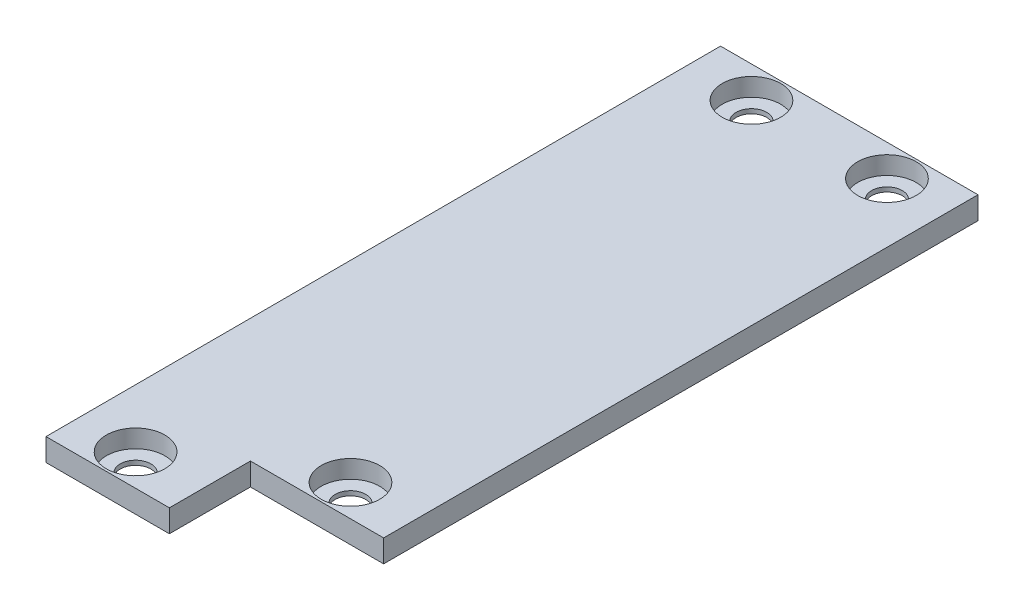
ISO-10303-21;
HEADER;
FILE_DESCRIPTION(('STEP AP214'),'2;1');
FILE_NAME('part.step','',(''),(''),'','','');
FILE_SCHEMA(('AUTOMOTIVE_DESIGN { 1 0 10303 214 1 1 1 1 }'));
ENDSEC;
DATA;
#1=APPLICATION_CONTEXT('core data for automotive mechanical design processes');
#2=APPLICATION_PROTOCOL_DEFINITION('international standard','automotive_design',2000,#1);
#3=PRODUCT_CONTEXT('',#1,'mechanical');
#4=PRODUCT('Part','Part','',(#3));
#5=PRODUCT_RELATED_PRODUCT_CATEGORY('part','',(#4));
#6=PRODUCT_DEFINITION_FORMATION('','',#4);
#7=PRODUCT_DEFINITION_CONTEXT('part definition',#1,'design');
#8=PRODUCT_DEFINITION('design','',#6,#7);
#9=PRODUCT_DEFINITION_SHAPE('','',#8);
#10=(LENGTH_UNIT() NAMED_UNIT(*) SI_UNIT(.MILLI.,.METRE.));
#11=(NAMED_UNIT(*) PLANE_ANGLE_UNIT() SI_UNIT($,.RADIAN.));
#12=(NAMED_UNIT(*) SI_UNIT($,.STERADIAN.) SOLID_ANGLE_UNIT());
#13=UNCERTAINTY_MEASURE_WITH_UNIT(LENGTH_MEASURE(1.E-05),#10,'distance_accuracy_value','');
#14=(GEOMETRIC_REPRESENTATION_CONTEXT(3) GLOBAL_UNCERTAINTY_ASSIGNED_CONTEXT((#13)) GLOBAL_UNIT_ASSIGNED_CONTEXT((#10,
#11,#12)) REPRESENTATION_CONTEXT('',''));
#15=CARTESIAN_POINT('',(0.,0.,0.));
#16=DIRECTION('',(0.,0.,1.));
#17=DIRECTION('',(1.,0.,0.));
#18=AXIS2_PLACEMENT_3D('',#15,#16,#17);
#19=CARTESIAN_POINT('',(0.,2.5,0.));
#20=DIRECTION('',(0.,-1.,0.));
#21=DIRECTION('',(0.,0.,-1.));
#22=AXIS2_PLACEMENT_3D('',#19,#20,#21);
#23=PLANE('',#22);
#24=CARTESIAN_POINT('',(21.88,2.5,-72.0000034625994));
#25=DIRECTION('',(0.,1.,0.));
#26=DIRECTION('',(0.,0.,1.));
#27=AXIS2_PLACEMENT_3D('',#24,#25,#26);
#28=CIRCLE('',#27,3.25);
#29=CARTESIAN_POINT('',(21.88,2.5,-68.7500034625994));
#30=VERTEX_POINT('',#29);
#31=EDGE_CURVE('E150',#30,#30,#28,.T.);
#32=ORIENTED_EDGE('',*,*,#31,.F.);
#33=EDGE_LOOP('',(#32));
#34=FACE_BOUND('',#33,.T.);
#35=CARTESIAN_POINT('',(21.31,2.5,-13.));
#36=DIRECTION('',(0.,1.,0.));
#37=DIRECTION('',(0.,0.,1.));
#38=AXIS2_PLACEMENT_3D('',#35,#36,#37);
#39=CIRCLE('',#38,3.25);
#40=CARTESIAN_POINT('',(21.31,2.5,-9.75));
#41=VERTEX_POINT('',#40);
#42=EDGE_CURVE('E166',#41,#41,#39,.T.);
#43=ORIENTED_EDGE('',*,*,#42,.F.);
#44=EDGE_LOOP('',(#43));
#45=FACE_BOUND('',#44,.T.);
#46=CARTESIAN_POINT('',(6.44473684666131,2.5,-3.99999653740062));
#47=DIRECTION('',(0.,1.,0.));
#48=DIRECTION('',(0.,0.,1.));
#49=AXIS2_PLACEMENT_3D('',#46,#47,#48);
#50=CIRCLE('',#49,3.25);
#51=CARTESIAN_POINT('',(6.44473684666131,2.5,-0.749996537400622));
#52=VERTEX_POINT('',#51);
#53=EDGE_CURVE('E182',#52,#52,#50,.T.);
#54=ORIENTED_EDGE('',*,*,#53,.F.);
#55=EDGE_LOOP('',(#54));
#56=FACE_BOUND('',#55,.T.);
#57=DIRECTION('',(-1.,0.,0.));
#58=VECTOR('',#57,1.);
#59=CARTESIAN_POINT('',(-0.000657894167335672,2.5,-0.499999567175077));
#60=LINE('',#59,#58);
#61=CARTESIAN_POINT('',(13.7,2.5,-0.499999567175077));
#62=VERTEX_POINT('',#61);
#63=CARTESIAN_POINT('',(-0.000657894167335672,2.5,-0.499999567175077));
#64=VERTEX_POINT('',#63);
#65=EDGE_CURVE('E111',#62,#64,#60,.T.);
#66=ORIENTED_EDGE('',*,*,#65,.F.);
#67=DIRECTION('',(0.,0.,1.));
#68=VECTOR('',#67,1.);
#69=CARTESIAN_POINT('',(13.7,2.5,-0.499999567175077));
#70=LINE('',#69,#68);
#71=CARTESIAN_POINT('',(13.7,2.5,-9.5));
#72=VERTEX_POINT('',#71);
#73=EDGE_CURVE('E54',#72,#62,#70,.T.);
#74=ORIENTED_EDGE('',*,*,#73,.F.);
#75=DIRECTION('',(-1.,0.,0.));
#76=VECTOR('',#75,1.);
#77=CARTESIAN_POINT('',(13.9,2.5,-9.5));
#78=LINE('',#77,#76);
#79=CARTESIAN_POINT('',(28.49,2.5,-9.5));
#80=VERTEX_POINT('',#79);
#81=EDGE_CURVE('E93',#80,#72,#78,.T.);
#82=ORIENTED_EDGE('',*,*,#81,.F.);
#83=DIRECTION('',(0.,0.,-1.));
#84=VECTOR('',#83,1.);
#85=CARTESIAN_POINT('',(28.49,2.5,-9.));
#86=LINE('',#85,#84);
#87=CARTESIAN_POINT('',(28.49,2.5,-75.5000004328249));
#88=VERTEX_POINT('',#87);
#89=EDGE_CURVE('E202',#80,#88,#86,.T.);
#90=ORIENTED_EDGE('',*,*,#89,.T.);
#91=DIRECTION('',(1.,0.,0.));
#92=VECTOR('',#91,1.);
#93=CARTESIAN_POINT('',(-0.0993421058326638,2.5,-75.5000004328249));
#94=LINE('',#93,#92);
#95=CARTESIAN_POINT('',(-0.0993421058326638,2.5,-75.5000004328249));
#96=VERTEX_POINT('',#95);
#97=EDGE_CURVE('E123',#96,#88,#94,.T.);
#98=ORIENTED_EDGE('',*,*,#97,.F.);
#99=DIRECTION('',(0.00131578833467125,0.,0.999999134350154));
#100=VECTOR('',#99,1.);
#101=CARTESIAN_POINT('',(-0.0999999999999994,2.5,-76.));
#102=LINE('',#101,#100);
#103=EDGE_CURVE('E199',#96,#64,#102,.T.);
#104=ORIENTED_EDGE('',*,*,#103,.T.);
#105=EDGE_LOOP('',(#66,#74,#82,#90,#98,#104));
#106=FACE_BOUND('',#105,.T.);
#107=CARTESIAN_POINT('',(6.83526315333869,2.5,-72.0000034625994));
#108=DIRECTION('',(0.,1.,0.));
#109=DIRECTION('',(0.,0.,1.));
#110=AXIS2_PLACEMENT_3D('',#107,#108,#109);
#111=CIRCLE('',#110,3.25);
#112=CARTESIAN_POINT('',(6.83526315333869,2.5,-68.7500034625994));
#113=VERTEX_POINT('',#112);
#114=EDGE_CURVE('E132',#113,#113,#111,.T.);
#115=ORIENTED_EDGE('',*,*,#114,.F.);
#116=EDGE_LOOP('',(#115));
#117=FACE_BOUND('',#116,.T.);
#118=ADVANCED_FACE('F38',(#34,#45,#56,#106,#117),#23,.F.);
#119=CARTESIAN_POINT('',(-0.0999999999999994,2.5,-76.));
#120=DIRECTION('',(0.999999134350154,0.,-0.00131578833467125));
#121=DIRECTION('',(-0.00131578833467125,0.,-0.999999134350155));
#122=AXIS2_PLACEMENT_3D('',#119,#120,#121);
#123=PLANE('',#122);
#124=DIRECTION('',(0.00131578833467125,0.,0.999999134350154));
#125=VECTOR('',#124,1.);
#126=CARTESIAN_POINT('',(-0.0999999999999994,0.,-76.));
#127=LINE('',#126,#125);
#128=CARTESIAN_POINT('',(-0.0993421058326638,0.,-75.5000004328249));
#129=VERTEX_POINT('',#128);
#130=CARTESIAN_POINT('',(-0.000657894167335624,0.,-0.499999567175081));
#131=VERTEX_POINT('',#130);
#132=EDGE_CURVE('E198',#129,#131,#127,.T.);
#133=ORIENTED_EDGE('',*,*,#132,.T.);
#134=DIRECTION('',(0.,1.,0.));
#135=VECTOR('',#134,1.);
#136=CARTESIAN_POINT('',(-0.000657894167335672,-7.5,-0.499999567175077));
#137=LINE('',#136,#135);
#138=EDGE_CURVE('E61',#131,#64,#137,.T.);
#139=ORIENTED_EDGE('',*,*,#138,.T.);
#140=ORIENTED_EDGE('',*,*,#103,.F.);
#141=DIRECTION('',(0.,1.,0.));
#142=VECTOR('',#141,1.);
#143=CARTESIAN_POINT('',(-0.0993421058326638,-7.5,-75.5000004328249));
#144=LINE('',#143,#142);
#145=EDGE_CURVE('E127',#129,#96,#144,.T.);
#146=ORIENTED_EDGE('',*,*,#145,.F.);
#147=EDGE_LOOP('',(#133,#139,#140,#146));
#148=FACE_BOUND('',#147,.T.);
#149=ADVANCED_FACE('F40',(#148),#123,.F.);
#150=CARTESIAN_POINT('',(28.49,2.5,-9.));
#151=DIRECTION('',(-1.,0.,0.));
#152=DIRECTION('',(0.,0.,1.));
#153=AXIS2_PLACEMENT_3D('',#150,#151,#152);
#154=PLANE('',#153);
#155=ORIENTED_EDGE('',*,*,#89,.F.);
#156=DIRECTION('',(0.,1.,0.));
#157=VECTOR('',#156,1.);
#158=CARTESIAN_POINT('',(28.49,-7.5,-9.5));
#159=LINE('',#158,#157);
#160=CARTESIAN_POINT('',(28.49,0.,-9.5));
#161=VERTEX_POINT('',#160);
#162=EDGE_CURVE('E97',#161,#80,#159,.T.);
#163=ORIENTED_EDGE('',*,*,#162,.F.);
#164=DIRECTION('',(0.,0.,-1.));
#165=VECTOR('',#164,1.);
#166=CARTESIAN_POINT('',(28.49,0.,-9.));
#167=LINE('',#166,#165);
#168=CARTESIAN_POINT('',(28.49,0.,-75.5000004328249));
#169=VERTEX_POINT('',#168);
#170=EDGE_CURVE('E203',#161,#169,#167,.T.);
#171=ORIENTED_EDGE('',*,*,#170,.T.);
#172=DIRECTION('',(0.,1.,0.));
#173=VECTOR('',#172,1.);
#174=CARTESIAN_POINT('',(28.49,-7.5,-75.5000004328249));
#175=LINE('',#174,#173);
#176=EDGE_CURVE('E128',#169,#88,#175,.T.);
#177=ORIENTED_EDGE('',*,*,#176,.T.);
#178=EDGE_LOOP('',(#155,#163,#171,#177));
#179=FACE_BOUND('',#178,.T.);
#180=ADVANCED_FACE('F231',(#179),#154,.F.);
#181=CARTESIAN_POINT('',(0.,0.,0.));
#182=DIRECTION('',(0.,-1.,0.));
#183=DIRECTION('',(0.,0.,-1.));
#184=AXIS2_PLACEMENT_3D('',#181,#182,#183);
#185=PLANE('',#184);
#186=DIRECTION('',(0.,0.,-1.));
#187=VECTOR('',#186,1.);
#188=CARTESIAN_POINT('',(13.7,0.,0.));
#189=LINE('',#188,#187);
#190=CARTESIAN_POINT('',(13.7,0.,-0.499999567175077));
#191=VERTEX_POINT('',#190);
#192=CARTESIAN_POINT('',(13.7,0.,-9.5));
#193=VERTEX_POINT('',#192);
#194=EDGE_CURVE('E105',#191,#193,#189,.T.);
#195=ORIENTED_EDGE('',*,*,#194,.F.);
#196=DIRECTION('',(1.,0.,0.));
#197=VECTOR('',#196,1.);
#198=CARTESIAN_POINT('',(0.,0.,-0.499999567175077));
#199=LINE('',#198,#197);
#200=EDGE_CURVE('E47',#131,#191,#199,.T.);
#201=ORIENTED_EDGE('',*,*,#200,.F.);
#202=ORIENTED_EDGE('',*,*,#132,.F.);
#203=DIRECTION('',(-1.,0.,0.));
#204=VECTOR('',#203,1.);
#205=CARTESIAN_POINT('',(0.,0.,-75.5000004328249));
#206=LINE('',#205,#204);
#207=EDGE_CURVE('E206',#169,#129,#206,.T.);
#208=ORIENTED_EDGE('',*,*,#207,.F.);
#209=ORIENTED_EDGE('',*,*,#170,.F.);
#210=DIRECTION('',(1.,0.,0.));
#211=VECTOR('',#210,1.);
#212=CARTESIAN_POINT('',(0.,0.,-9.5));
#213=LINE('',#212,#211);
#214=EDGE_CURVE('E214',#193,#161,#213,.T.);
#215=ORIENTED_EDGE('',*,*,#214,.F.);
#216=EDGE_LOOP('',(#195,#201,#202,#208,#209,#215));
#217=FACE_BOUND('',#216,.T.);
#218=CARTESIAN_POINT('',(6.83526315333869,0.,-72.0000034625994));
#219=DIRECTION('',(0.,-1.,0.));
#220=DIRECTION('',(0.,0.,-1.));
#221=AXIS2_PLACEMENT_3D('',#218,#219,#220);
#222=CIRCLE('',#221,1.7);
#223=CARTESIAN_POINT('',(6.83526315333869,0.,-73.7000034625994));
#224=VERTEX_POINT('',#223);
#225=EDGE_CURVE('E146',#224,#224,#222,.T.);
#226=ORIENTED_EDGE('',*,*,#225,.F.);
#227=EDGE_LOOP('',(#226));
#228=FACE_BOUND('',#227,.T.);
#229=CARTESIAN_POINT('',(21.88,0.,-72.0000034625994));
#230=DIRECTION('',(0.,-1.,0.));
#231=DIRECTION('',(0.,0.,-1.));
#232=AXIS2_PLACEMENT_3D('',#229,#230,#231);
#233=CIRCLE('',#232,1.7);
#234=CARTESIAN_POINT('',(21.88,0.,-73.7000034625994));
#235=VERTEX_POINT('',#234);
#236=EDGE_CURVE('E162',#235,#235,#233,.T.);
#237=ORIENTED_EDGE('',*,*,#236,.F.);
#238=EDGE_LOOP('',(#237));
#239=FACE_BOUND('',#238,.T.);
#240=CARTESIAN_POINT('',(21.31,0.,-13.));
#241=DIRECTION('',(0.,-1.,0.));
#242=DIRECTION('',(0.,0.,-1.));
#243=AXIS2_PLACEMENT_3D('',#240,#241,#242);
#244=CIRCLE('',#243,1.7);
#245=CARTESIAN_POINT('',(21.31,0.,-14.7));
#246=VERTEX_POINT('',#245);
#247=EDGE_CURVE('E178',#246,#246,#244,.T.);
#248=ORIENTED_EDGE('',*,*,#247,.F.);
#249=EDGE_LOOP('',(#248));
#250=FACE_BOUND('',#249,.T.);
#251=CARTESIAN_POINT('',(6.44473684666131,0.,-3.99999653740062));
#252=DIRECTION('',(0.,-1.,0.));
#253=DIRECTION('',(0.,0.,-1.));
#254=AXIS2_PLACEMENT_3D('',#251,#252,#253);
#255=CIRCLE('',#254,1.7);
#256=CARTESIAN_POINT('',(6.44473684666131,0.,-5.69999653740062));
#257=VERTEX_POINT('',#256);
#258=EDGE_CURVE('E194',#257,#257,#255,.T.);
#259=ORIENTED_EDGE('',*,*,#258,.F.);
#260=EDGE_LOOP('',(#259));
#261=FACE_BOUND('',#260,.T.);
#262=ADVANCED_FACE('F220',(#217,#228,#239,#250,#261),#185,.T.);
#263=CARTESIAN_POINT('',(6.44473684666131,2.5,-3.99999653740062));
#264=DIRECTION('',(0.,1.,0.));
#265=DIRECTION('',(0.,0.,1.));
#266=AXIS2_PLACEMENT_3D('',#263,#264,#265);
#267=CYLINDRICAL_SURFACE('',#266,1.7);
#268=CARTESIAN_POINT('',(6.44473684666131,0.499999999999998,-3.99999653740062));
#269=DIRECTION('',(0.,1.,0.));
#270=DIRECTION('',(0.,0.,1.));
#271=AXIS2_PLACEMENT_3D('',#268,#269,#270);
#272=CIRCLE('',#271,1.7);
#273=CARTESIAN_POINT('',(6.44473684666131,0.499999999999998,-2.29999653740062));
#274=VERTEX_POINT('',#273);
#275=EDGE_CURVE('E190',#274,#274,#272,.T.);
#276=ORIENTED_EDGE('',*,*,#275,.T.);
#277=EDGE_LOOP('',(#276));
#278=FACE_BOUND('',#277,.T.);
#279=ORIENTED_EDGE('',*,*,#258,.T.);
#280=EDGE_LOOP('',(#279));
#281=FACE_BOUND('',#280,.T.);
#282=ADVANCED_FACE('F239',(#278,#281),#267,.F.);
#283=CARTESIAN_POINT('',(8.14473684666131,0.499999999999998,-3.99999653740062));
#284=DIRECTION('',(0.,-1.,0.));
#285=DIRECTION('',(0.,0.,-1.));
#286=AXIS2_PLACEMENT_3D('',#283,#284,#285);
#287=PLANE('',#286);
#288=ORIENTED_EDGE('',*,*,#275,.F.);
#289=EDGE_LOOP('',(#288));
#290=FACE_BOUND('',#289,.T.);
#291=CARTESIAN_POINT('',(6.44473684666131,0.499999999999998,-3.99999653740062));
#292=DIRECTION('',(0.,1.,0.));
#293=DIRECTION('',(0.,0.,1.));
#294=AXIS2_PLACEMENT_3D('',#291,#292,#293);
#295=CIRCLE('',#294,3.25);
#296=CARTESIAN_POINT('',(6.44473684666131,0.499999999999998,-0.749996537400622));
#297=VERTEX_POINT('',#296);
#298=EDGE_CURVE('E186',#297,#297,#295,.T.);
#299=ORIENTED_EDGE('',*,*,#298,.T.);
#300=EDGE_LOOP('',(#299));
#301=FACE_BOUND('',#300,.T.);
#302=ADVANCED_FACE('F251',(#290,#301),#287,.F.);
#303=CARTESIAN_POINT('',(6.44473684666131,2.5,-3.99999653740062));
#304=DIRECTION('',(0.,1.,0.));
#305=DIRECTION('',(0.,0.,1.));
#306=AXIS2_PLACEMENT_3D('',#303,#304,#305);
#307=CYLINDRICAL_SURFACE('',#306,3.25);
#308=ORIENTED_EDGE('',*,*,#298,.F.);
#309=EDGE_LOOP('',(#308));
#310=FACE_BOUND('',#309,.T.);
#311=ORIENTED_EDGE('',*,*,#53,.T.);
#312=EDGE_LOOP('',(#311));
#313=FACE_BOUND('',#312,.T.);
#314=ADVANCED_FACE('F255',(#310,#313),#307,.F.);
#315=CARTESIAN_POINT('',(21.31,2.5,-13.));
#316=DIRECTION('',(0.,1.,0.));
#317=DIRECTION('',(0.,0.,1.));
#318=AXIS2_PLACEMENT_3D('',#315,#316,#317);
#319=CYLINDRICAL_SURFACE('',#318,1.7);
#320=CARTESIAN_POINT('',(21.31,0.499999999999998,-13.));
#321=DIRECTION('',(0.,1.,0.));
#322=DIRECTION('',(0.,0.,1.));
#323=AXIS2_PLACEMENT_3D('',#320,#321,#322);
#324=CIRCLE('',#323,1.7);
#325=CARTESIAN_POINT('',(21.31,0.499999999999998,-11.3));
#326=VERTEX_POINT('',#325);
#327=EDGE_CURVE('E174',#326,#326,#324,.T.);
#328=ORIENTED_EDGE('',*,*,#327,.T.);
#329=EDGE_LOOP('',(#328));
#330=FACE_BOUND('',#329,.T.);
#331=ORIENTED_EDGE('',*,*,#247,.T.);
#332=EDGE_LOOP('',(#331));
#333=FACE_BOUND('',#332,.T.);
#334=ADVANCED_FACE('F259',(#330,#333),#319,.F.);
#335=CARTESIAN_POINT('',(23.01,0.499999999999998,-13.));
#336=DIRECTION('',(0.,-1.,0.));
#337=DIRECTION('',(0.,0.,-1.));
#338=AXIS2_PLACEMENT_3D('',#335,#336,#337);
#339=PLANE('',#338);
#340=ORIENTED_EDGE('',*,*,#327,.F.);
#341=EDGE_LOOP('',(#340));
#342=FACE_BOUND('',#341,.T.);
#343=CARTESIAN_POINT('',(21.31,0.499999999999998,-13.));
#344=DIRECTION('',(0.,1.,0.));
#345=DIRECTION('',(0.,0.,1.));
#346=AXIS2_PLACEMENT_3D('',#343,#344,#345);
#347=CIRCLE('',#346,3.25);
#348=CARTESIAN_POINT('',(21.31,0.499999999999998,-9.75));
#349=VERTEX_POINT('',#348);
#350=EDGE_CURVE('E170',#349,#349,#347,.T.);
#351=ORIENTED_EDGE('',*,*,#350,.T.);
#352=EDGE_LOOP('',(#351));
#353=FACE_BOUND('',#352,.T.);
#354=ADVANCED_FACE('F263',(#342,#353),#339,.F.);
#355=CARTESIAN_POINT('',(21.31,2.5,-13.));
#356=DIRECTION('',(0.,1.,0.));
#357=DIRECTION('',(0.,0.,1.));
#358=AXIS2_PLACEMENT_3D('',#355,#356,#357);
#359=CYLINDRICAL_SURFACE('',#358,3.25);
#360=ORIENTED_EDGE('',*,*,#350,.F.);
#361=EDGE_LOOP('',(#360));
#362=FACE_BOUND('',#361,.T.);
#363=ORIENTED_EDGE('',*,*,#42,.T.);
#364=EDGE_LOOP('',(#363));
#365=FACE_BOUND('',#364,.T.);
#366=ADVANCED_FACE('F267',(#362,#365),#359,.F.);
#367=CARTESIAN_POINT('',(21.88,2.5,-72.0000034625994));
#368=DIRECTION('',(0.,1.,0.));
#369=DIRECTION('',(0.,0.,1.));
#370=AXIS2_PLACEMENT_3D('',#367,#368,#369);
#371=CYLINDRICAL_SURFACE('',#370,1.7);
#372=CARTESIAN_POINT('',(21.88,0.499999999999998,-72.0000034625994));
#373=DIRECTION('',(0.,1.,0.));
#374=DIRECTION('',(0.,0.,1.));
#375=AXIS2_PLACEMENT_3D('',#372,#373,#374);
#376=CIRCLE('',#375,1.7);
#377=CARTESIAN_POINT('',(21.88,0.499999999999998,-70.3000034625994));
#378=VERTEX_POINT('',#377);
#379=EDGE_CURVE('E158',#378,#378,#376,.T.);
#380=ORIENTED_EDGE('',*,*,#379,.T.);
#381=EDGE_LOOP('',(#380));
#382=FACE_BOUND('',#381,.T.);
#383=ORIENTED_EDGE('',*,*,#236,.T.);
#384=EDGE_LOOP('',(#383));
#385=FACE_BOUND('',#384,.T.);
#386=ADVANCED_FACE('F271',(#382,#385),#371,.F.);
#387=CARTESIAN_POINT('',(23.58,0.499999999999998,-72.0000034625994));
#388=DIRECTION('',(0.,-1.,0.));
#389=DIRECTION('',(0.,0.,-1.));
#390=AXIS2_PLACEMENT_3D('',#387,#388,#389);
#391=PLANE('',#390);
#392=ORIENTED_EDGE('',*,*,#379,.F.);
#393=EDGE_LOOP('',(#392));
#394=FACE_BOUND('',#393,.T.);
#395=CARTESIAN_POINT('',(21.88,0.499999999999998,-72.0000034625994));
#396=DIRECTION('',(0.,1.,0.));
#397=DIRECTION('',(0.,0.,1.));
#398=AXIS2_PLACEMENT_3D('',#395,#396,#397);
#399=CIRCLE('',#398,3.25);
#400=CARTESIAN_POINT('',(21.88,0.499999999999998,-68.7500034625994));
#401=VERTEX_POINT('',#400);
#402=EDGE_CURVE('E154',#401,#401,#399,.T.);
#403=ORIENTED_EDGE('',*,*,#402,.T.);
#404=EDGE_LOOP('',(#403));
#405=FACE_BOUND('',#404,.T.);
#406=ADVANCED_FACE('F275',(#394,#405),#391,.F.);
#407=CARTESIAN_POINT('',(21.88,2.5,-72.0000034625994));
#408=DIRECTION('',(0.,1.,0.));
#409=DIRECTION('',(0.,0.,1.));
#410=AXIS2_PLACEMENT_3D('',#407,#408,#409);
#411=CYLINDRICAL_SURFACE('',#410,3.25);
#412=ORIENTED_EDGE('',*,*,#402,.F.);
#413=EDGE_LOOP('',(#412));
#414=FACE_BOUND('',#413,.T.);
#415=ORIENTED_EDGE('',*,*,#31,.T.);
#416=EDGE_LOOP('',(#415));
#417=FACE_BOUND('',#416,.T.);
#418=ADVANCED_FACE('F279',(#414,#417),#411,.F.);
#419=CARTESIAN_POINT('',(6.83526315333869,2.5,-72.0000034625994));
#420=DIRECTION('',(0.,1.,0.));
#421=DIRECTION('',(0.,0.,1.));
#422=AXIS2_PLACEMENT_3D('',#419,#420,#421);
#423=CYLINDRICAL_SURFACE('',#422,1.7);
#424=CARTESIAN_POINT('',(6.83526315333869,0.499999999999998,-72.0000034625994));
#425=DIRECTION('',(0.,1.,0.));
#426=DIRECTION('',(0.,0.,1.));
#427=AXIS2_PLACEMENT_3D('',#424,#425,#426);
#428=CIRCLE('',#427,1.7);
#429=CARTESIAN_POINT('',(6.83526315333869,0.499999999999998,-70.3000034625994));
#430=VERTEX_POINT('',#429);
#431=EDGE_CURVE('E142',#430,#430,#428,.T.);
#432=ORIENTED_EDGE('',*,*,#431,.T.);
#433=EDGE_LOOP('',(#432));
#434=FACE_BOUND('',#433,.T.);
#435=ORIENTED_EDGE('',*,*,#225,.T.);
#436=EDGE_LOOP('',(#435));
#437=FACE_BOUND('',#436,.T.);
#438=ADVANCED_FACE('F283',(#434,#437),#423,.F.);
#439=CARTESIAN_POINT('',(8.53526315333868,0.499999999999998,-72.0000034625994));
#440=DIRECTION('',(0.,-1.,0.));
#441=DIRECTION('',(0.,0.,-1.));
#442=AXIS2_PLACEMENT_3D('',#439,#440,#441);
#443=PLANE('',#442);
#444=ORIENTED_EDGE('',*,*,#431,.F.);
#445=EDGE_LOOP('',(#444));
#446=FACE_BOUND('',#445,.T.);
#447=CARTESIAN_POINT('',(6.83526315333869,0.499999999999998,-72.0000034625994));
#448=DIRECTION('',(0.,1.,0.));
#449=DIRECTION('',(0.,0.,1.));
#450=AXIS2_PLACEMENT_3D('',#447,#448,#449);
#451=CIRCLE('',#450,3.25);
#452=CARTESIAN_POINT('',(6.83526315333869,0.499999999999998,-68.7500034625994));
#453=VERTEX_POINT('',#452);
#454=EDGE_CURVE('E138',#453,#453,#451,.T.);
#455=ORIENTED_EDGE('',*,*,#454,.T.);
#456=EDGE_LOOP('',(#455));
#457=FACE_BOUND('',#456,.T.);
#458=ADVANCED_FACE('F287',(#446,#457),#443,.F.);
#459=CARTESIAN_POINT('',(6.83526315333869,2.5,-72.0000034625994));
#460=DIRECTION('',(0.,1.,0.));
#461=DIRECTION('',(0.,0.,1.));
#462=AXIS2_PLACEMENT_3D('',#459,#460,#461);
#463=CYLINDRICAL_SURFACE('',#462,3.25);
#464=ORIENTED_EDGE('',*,*,#454,.F.);
#465=EDGE_LOOP('',(#464));
#466=FACE_BOUND('',#465,.T.);
#467=ORIENTED_EDGE('',*,*,#114,.T.);
#468=EDGE_LOOP('',(#467));
#469=FACE_BOUND('',#468,.T.);
#470=ADVANCED_FACE('F291',(#466,#469),#463,.F.);
#471=CARTESIAN_POINT('',(-0.0993421058326638,-7.5,-75.5000004328249));
#472=DIRECTION('',(0.,0.,1.));
#473=DIRECTION('',(1.,0.,0.));
#474=AXIS2_PLACEMENT_3D('',#471,#472,#473);
#475=PLANE('',#474);
#476=ORIENTED_EDGE('',*,*,#207,.T.);
#477=ORIENTED_EDGE('',*,*,#145,.T.);
#478=ORIENTED_EDGE('',*,*,#97,.T.);
#479=ORIENTED_EDGE('',*,*,#176,.F.);
#480=EDGE_LOOP('',(#476,#477,#478,#479));
#481=FACE_BOUND('',#480,.T.);
#482=ADVANCED_FACE('F228',(#481),#475,.F.);
#483=CARTESIAN_POINT('',(13.9,-7.5,-9.5));
#484=DIRECTION('',(0.,0.,-1.));
#485=DIRECTION('',(-1.,0.,0.));
#486=AXIS2_PLACEMENT_3D('',#483,#484,#485);
#487=PLANE('',#486);
#488=ORIENTED_EDGE('',*,*,#214,.T.);
#489=ORIENTED_EDGE('',*,*,#162,.T.);
#490=ORIENTED_EDGE('',*,*,#81,.T.);
#491=DIRECTION('',(0.,1.,0.));
#492=VECTOR('',#491,1.);
#493=CARTESIAN_POINT('',(13.7,-7.5,-9.5));
#494=LINE('',#493,#492);
#495=EDGE_CURVE('E95',#193,#72,#494,.T.);
#496=ORIENTED_EDGE('',*,*,#495,.F.);
#497=EDGE_LOOP('',(#488,#489,#490,#496));
#498=FACE_BOUND('',#497,.T.);
#499=ADVANCED_FACE('F94',(#498),#487,.F.);
#500=CARTESIAN_POINT('',(-0.000657894167335672,-7.5,-0.499999567175077));
#501=DIRECTION('',(0.,0.,-1.));
#502=DIRECTION('',(-1.,0.,0.));
#503=AXIS2_PLACEMENT_3D('',#500,#501,#502);
#504=PLANE('',#503);
#505=ORIENTED_EDGE('',*,*,#200,.T.);
#506=DIRECTION('',(0.,1.,0.));
#507=VECTOR('',#506,1.);
#508=CARTESIAN_POINT('',(13.7,-7.5,-0.499999567175077));
#509=LINE('',#508,#507);
#510=EDGE_CURVE('E11',#191,#62,#509,.T.);
#511=ORIENTED_EDGE('',*,*,#510,.T.);
#512=ORIENTED_EDGE('',*,*,#65,.T.);
#513=ORIENTED_EDGE('',*,*,#138,.F.);
#514=EDGE_LOOP('',(#505,#511,#512,#513));
#515=FACE_BOUND('',#514,.T.);
#516=ADVANCED_FACE('F217',(#515),#504,.F.);
#517=CARTESIAN_POINT('',(13.7,-7.5,-0.499999567175077));
#518=DIRECTION('',(-1.,0.,0.));
#519=DIRECTION('',(0.,0.,1.));
#520=AXIS2_PLACEMENT_3D('',#517,#518,#519);
#521=PLANE('',#520);
#522=ORIENTED_EDGE('',*,*,#194,.T.);
#523=ORIENTED_EDGE('',*,*,#495,.T.);
#524=ORIENTED_EDGE('',*,*,#73,.T.);
#525=ORIENTED_EDGE('',*,*,#510,.F.);
#526=EDGE_LOOP('',(#522,#523,#524,#525));
#527=FACE_BOUND('',#526,.T.);
#528=ADVANCED_FACE('F103',(#527),#521,.F.);
#529=CLOSED_SHELL('',(#118,#149,#180,#262,#282,#302,#314,#334,#354,#366,#386,#406,#418,#438,
#458,#470,#482,#499,#516,#528));
#530=MANIFOLD_SOLID_BREP('B2',#529);
#531=ADVANCED_BREP_SHAPE_REPRESENTATION('',(#18,#530),#14);
#532=SHAPE_DEFINITION_REPRESENTATION(#9,#531);
ENDSEC;
END-ISO-10303-21;
